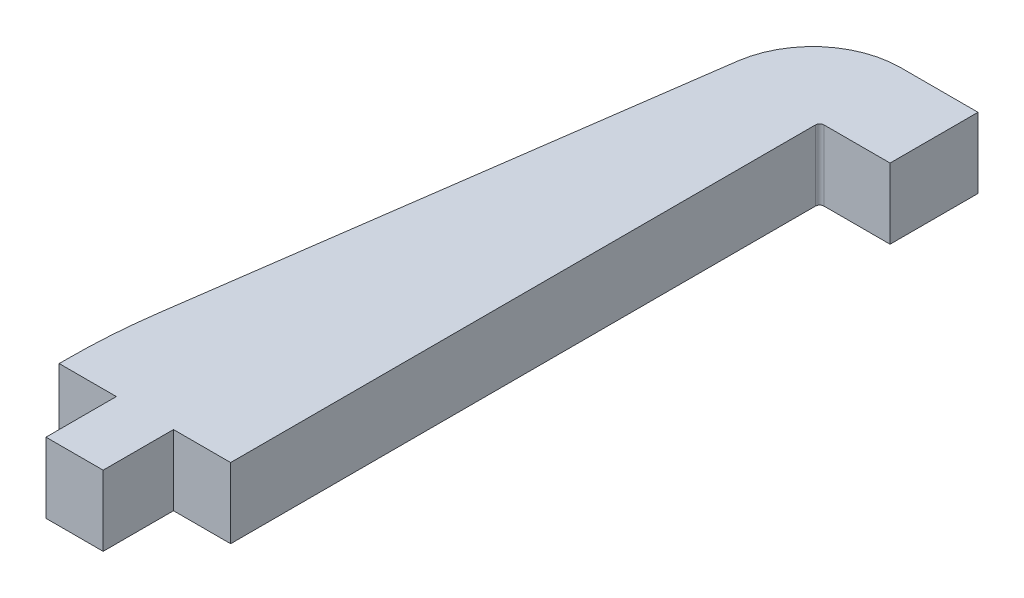
ISO-10303-21;
HEADER;
FILE_DESCRIPTION(('STEP AP214'),'2;1');
FILE_NAME('part.step','',(''),(''),'','','');
FILE_SCHEMA(('AUTOMOTIVE_DESIGN { 1 0 10303 214 1 1 1 1 }'));
ENDSEC;
DATA;
#1=APPLICATION_CONTEXT('core data for automotive mechanical design processes');
#2=APPLICATION_PROTOCOL_DEFINITION('international standard','automotive_design',2000,#1);
#3=PRODUCT_CONTEXT('',#1,'mechanical');
#4=PRODUCT('Part','Part','',(#3));
#5=PRODUCT_RELATED_PRODUCT_CATEGORY('part','',(#4));
#6=PRODUCT_DEFINITION_FORMATION('','',#4);
#7=PRODUCT_DEFINITION_CONTEXT('part definition',#1,'design');
#8=PRODUCT_DEFINITION('design','',#6,#7);
#9=PRODUCT_DEFINITION_SHAPE('','',#8);
#10=(LENGTH_UNIT() NAMED_UNIT(*) SI_UNIT(.MILLI.,.METRE.));
#11=(NAMED_UNIT(*) PLANE_ANGLE_UNIT() SI_UNIT($,.RADIAN.));
#12=(NAMED_UNIT(*) SI_UNIT($,.STERADIAN.) SOLID_ANGLE_UNIT());
#13=UNCERTAINTY_MEASURE_WITH_UNIT(LENGTH_MEASURE(1.E-05),#10,'distance_accuracy_value','');
#14=(GEOMETRIC_REPRESENTATION_CONTEXT(3) GLOBAL_UNCERTAINTY_ASSIGNED_CONTEXT((#13)) GLOBAL_UNIT_ASSIGNED_CONTEXT((#10,
#11,#12)) REPRESENTATION_CONTEXT('',''));
#15=CARTESIAN_POINT('',(0.,0.,0.));
#16=DIRECTION('',(0.,0.,1.));
#17=DIRECTION('',(1.,0.,0.));
#18=AXIS2_PLACEMENT_3D('',#15,#16,#17);
#19=CARTESIAN_POINT('',(0.,8.,-77.));
#20=DIRECTION('',(0.,0.,1.));
#21=DIRECTION('',(1.,0.,0.));
#22=AXIS2_PLACEMENT_3D('',#19,#20,#21);
#23=PLANE('',#22);
#24=DIRECTION('',(-1.,0.,0.));
#25=VECTOR('',#24,1.);
#26=CARTESIAN_POINT('',(0.,0.,-77.));
#27=LINE('',#26,#25);
#28=CARTESIAN_POINT('',(27.5,0.,-77.));
#29=VERTEX_POINT('',#28);
#30=CARTESIAN_POINT('',(18.6928673781623,0.,-77.));
#31=VERTEX_POINT('',#30);
#32=EDGE_CURVE('E203',#29,#31,#27,.T.);
#33=ORIENTED_EDGE('',*,*,#32,.T.);
#34=DIRECTION('',(0.,-1.,0.));
#35=VECTOR('',#34,1.);
#36=CARTESIAN_POINT('',(18.6928673781623,8.,-77.));
#37=LINE('',#36,#35);
#38=CARTESIAN_POINT('',(18.6928673781623,8.,-77.));
#39=VERTEX_POINT('',#38);
#40=EDGE_CURVE('E261',#31,#39,#37,.F.);
#41=ORIENTED_EDGE('',*,*,#40,.T.);
#42=DIRECTION('',(-1.,0.,0.));
#43=VECTOR('',#42,1.);
#44=CARTESIAN_POINT('',(0.,8.,-77.));
#45=LINE('',#44,#43);
#46=CARTESIAN_POINT('',(27.5,8.,-77.));
#47=VERTEX_POINT('',#46);
#48=EDGE_CURVE('E157',#47,#39,#45,.T.);
#49=ORIENTED_EDGE('',*,*,#48,.F.);
#50=DIRECTION('',(0.,-1.,0.));
#51=VECTOR('',#50,1.);
#52=CARTESIAN_POINT('',(27.5,8.,-77.));
#53=LINE('',#52,#51);
#54=EDGE_CURVE('E202',#47,#29,#53,.T.);
#55=ORIENTED_EDGE('',*,*,#54,.T.);
#56=EDGE_LOOP('',(#33,#41,#49,#55));
#57=FACE_BOUND('',#56,.T.);
#58=ADVANCED_FACE('F42',(#57),#23,.F.);
#59=CARTESIAN_POINT('',(0.,8.,0.));
#60=DIRECTION('',(1.,0.,0.));
#61=DIRECTION('',(0.,0.,-1.));
#62=AXIS2_PLACEMENT_3D('',#59,#60,#61);
#63=PLANE('',#62);
#64=DIRECTION('',(0.,0.,1.));
#65=VECTOR('',#64,1.);
#66=CARTESIAN_POINT('',(0.,8.,0.));
#67=LINE('',#66,#65);
#68=CARTESIAN_POINT('',(0.,8.,-0.951425940112669));
#69=VERTEX_POINT('',#68);
#70=CARTESIAN_POINT('',(0.,8.,0.));
#71=VERTEX_POINT('',#70);
#72=EDGE_CURVE('E143',#69,#71,#67,.T.);
#73=ORIENTED_EDGE('',*,*,#72,.F.);
#74=DIRECTION('',(0.,1.,0.));
#75=VECTOR('',#74,1.);
#76=CARTESIAN_POINT('',(0.,0.,-0.951425940112669));
#77=LINE('',#76,#75);
#78=CARTESIAN_POINT('',(0.,0.,-0.951425940112669));
#79=VERTEX_POINT('',#78);
#80=EDGE_CURVE('E275',#69,#79,#77,.F.);
#81=ORIENTED_EDGE('',*,*,#80,.T.);
#82=DIRECTION('',(0.,0.,1.));
#83=VECTOR('',#82,1.);
#84=CARTESIAN_POINT('',(0.,0.,0.));
#85=LINE('',#84,#83);
#86=CARTESIAN_POINT('',(0.,0.,0.));
#87=VERTEX_POINT('',#86);
#88=EDGE_CURVE('E163',#79,#87,#85,.T.);
#89=ORIENTED_EDGE('',*,*,#88,.T.);
#90=DIRECTION('',(0.,-1.,0.));
#91=VECTOR('',#90,1.);
#92=CARTESIAN_POINT('',(0.,8.,0.));
#93=LINE('',#92,#91);
#94=EDGE_CURVE('E160',#71,#87,#93,.T.);
#95=ORIENTED_EDGE('',*,*,#94,.F.);
#96=EDGE_LOOP('',(#73,#81,#89,#95));
#97=FACE_BOUND('',#96,.T.);
#98=ADVANCED_FACE('F161',(#97),#63,.F.);
#99=CARTESIAN_POINT('',(0.,8.,0.));
#100=DIRECTION('',(0.,0.,-1.));
#101=DIRECTION('',(-1.,0.,0.));
#102=AXIS2_PLACEMENT_3D('',#99,#100,#101);
#103=PLANE('',#102);
#104=DIRECTION('',(1.,0.,0.));
#105=VECTOR('',#104,1.);
#106=CARTESIAN_POINT('',(0.,0.,0.));
#107=LINE('',#106,#105);
#108=CARTESIAN_POINT('',(6.5,0.,0.));
#109=VERTEX_POINT('',#108);
#110=EDGE_CURVE('E209',#87,#109,#107,.T.);
#111=ORIENTED_EDGE('',*,*,#110,.T.);
#112=DIRECTION('',(0.,-1.,0.));
#113=VECTOR('',#112,1.);
#114=CARTESIAN_POINT('',(6.5,8.,0.));
#115=LINE('',#114,#113);
#116=CARTESIAN_POINT('',(6.5,8.,0.));
#117=VERTEX_POINT('',#116);
#118=EDGE_CURVE('E169',#117,#109,#115,.T.);
#119=ORIENTED_EDGE('',*,*,#118,.F.);
#120=DIRECTION('',(1.,0.,0.));
#121=VECTOR('',#120,1.);
#122=CARTESIAN_POINT('',(0.,8.,0.));
#123=LINE('',#122,#121);
#124=EDGE_CURVE('E149',#71,#117,#123,.T.);
#125=ORIENTED_EDGE('',*,*,#124,.F.);
#126=ORIENTED_EDGE('',*,*,#94,.T.);
#127=EDGE_LOOP('',(#111,#119,#125,#126));
#128=FACE_BOUND('',#127,.T.);
#129=ADVANCED_FACE('F171',(#128),#103,.F.);
#130=CARTESIAN_POINT('',(6.5,8.,0.));
#131=DIRECTION('',(-1.,0.,0.));
#132=DIRECTION('',(0.,0.,1.));
#133=AXIS2_PLACEMENT_3D('',#130,#131,#132);
#134=PLANE('',#133);
#135=DIRECTION('',(0.,0.,-1.));
#136=VECTOR('',#135,1.);
#137=CARTESIAN_POINT('',(6.5,0.,0.));
#138=LINE('',#137,#136);
#139=CARTESIAN_POINT('',(6.5,0.,8.));
#140=VERTEX_POINT('',#139);
#141=EDGE_CURVE('E212',#140,#109,#138,.T.);
#142=ORIENTED_EDGE('',*,*,#141,.F.);
#143=DIRECTION('',(0.,-1.,0.));
#144=VECTOR('',#143,1.);
#145=CARTESIAN_POINT('',(6.5,8.,8.));
#146=LINE('',#145,#144);
#147=CARTESIAN_POINT('',(6.5,8.,8.));
#148=VERTEX_POINT('',#147);
#149=EDGE_CURVE('E251',#148,#140,#146,.T.);
#150=ORIENTED_EDGE('',*,*,#149,.F.);
#151=DIRECTION('',(0.,0.,-1.));
#152=VECTOR('',#151,1.);
#153=CARTESIAN_POINT('',(6.5,8.,0.));
#154=LINE('',#153,#152);
#155=EDGE_CURVE('E174',#148,#117,#154,.T.);
#156=ORIENTED_EDGE('',*,*,#155,.T.);
#157=ORIENTED_EDGE('',*,*,#118,.T.);
#158=EDGE_LOOP('',(#142,#150,#156,#157));
#159=FACE_BOUND('',#158,.T.);
#160=ADVANCED_FACE('F361',(#159),#134,.T.);
#161=CARTESIAN_POINT('',(0.,8.,8.));
#162=DIRECTION('',(0.,0.,-1.));
#163=DIRECTION('',(-1.,0.,0.));
#164=AXIS2_PLACEMENT_3D('',#161,#162,#163);
#165=PLANE('',#164);
#166=DIRECTION('',(1.,0.,0.));
#167=VECTOR('',#166,1.);
#168=CARTESIAN_POINT('',(0.,0.,8.));
#169=LINE('',#168,#167);
#170=CARTESIAN_POINT('',(13.,0.,8.));
#171=VERTEX_POINT('',#170);
#172=EDGE_CURVE('E217',#140,#171,#169,.T.);
#173=ORIENTED_EDGE('',*,*,#172,.T.);
#174=DIRECTION('',(0.,-1.,0.));
#175=VECTOR('',#174,1.);
#176=CARTESIAN_POINT('',(13.,8.,8.));
#177=LINE('',#176,#175);
#178=CARTESIAN_POINT('',(13.,8.,8.));
#179=VERTEX_POINT('',#178);
#180=EDGE_CURVE('E248',#179,#171,#177,.T.);
#181=ORIENTED_EDGE('',*,*,#180,.F.);
#182=DIRECTION('',(1.,0.,0.));
#183=VECTOR('',#182,1.);
#184=CARTESIAN_POINT('',(0.,8.,8.));
#185=LINE('',#184,#183);
#186=EDGE_CURVE('E178',#148,#179,#185,.T.);
#187=ORIENTED_EDGE('',*,*,#186,.F.);
#188=ORIENTED_EDGE('',*,*,#149,.T.);
#189=EDGE_LOOP('',(#173,#181,#187,#188));
#190=FACE_BOUND('',#189,.T.);
#191=ADVANCED_FACE('F359',(#190),#165,.F.);
#192=CARTESIAN_POINT('',(13.,8.,0.));
#193=DIRECTION('',(1.,0.,0.));
#194=DIRECTION('',(0.,0.,-1.));
#195=AXIS2_PLACEMENT_3D('',#192,#193,#194);
#196=PLANE('',#195);
#197=DIRECTION('',(0.,0.,1.));
#198=VECTOR('',#197,1.);
#199=CARTESIAN_POINT('',(13.,0.,0.));
#200=LINE('',#199,#198);
#201=CARTESIAN_POINT('',(13.,0.,0.));
#202=VERTEX_POINT('',#201);
#203=EDGE_CURVE('E221',#202,#171,#200,.T.);
#204=ORIENTED_EDGE('',*,*,#203,.F.);
#205=DIRECTION('',(0.,-1.,0.));
#206=VECTOR('',#205,1.);
#207=CARTESIAN_POINT('',(13.,8.,0.));
#208=LINE('',#207,#206);
#209=CARTESIAN_POINT('',(13.,8.,0.));
#210=VERTEX_POINT('',#209);
#211=EDGE_CURVE('E245',#210,#202,#208,.T.);
#212=ORIENTED_EDGE('',*,*,#211,.F.);
#213=DIRECTION('',(0.,0.,1.));
#214=VECTOR('',#213,1.);
#215=CARTESIAN_POINT('',(13.,8.,0.));
#216=LINE('',#215,#214);
#217=EDGE_CURVE('E182',#210,#179,#216,.T.);
#218=ORIENTED_EDGE('',*,*,#217,.T.);
#219=ORIENTED_EDGE('',*,*,#180,.T.);
#220=EDGE_LOOP('',(#204,#212,#218,#219));
#221=FACE_BOUND('',#220,.T.);
#222=ADVANCED_FACE('F353',(#221),#196,.T.);
#223=CARTESIAN_POINT('',(19.5,0.,0.));
#224=VERTEX_POINT('',#223);
#225=EDGE_CURVE('E213',#202,#224,#107,.T.);
#226=ORIENTED_EDGE('',*,*,#225,.T.);
#227=DIRECTION('',(0.,-1.,0.));
#228=VECTOR('',#227,1.);
#229=CARTESIAN_POINT('',(19.5,8.,0.));
#230=LINE('',#229,#228);
#231=CARTESIAN_POINT('',(19.5,8.,0.));
#232=VERTEX_POINT('',#231);
#233=EDGE_CURVE('E241',#232,#224,#230,.T.);
#234=ORIENTED_EDGE('',*,*,#233,.F.);
#235=EDGE_CURVE('E176',#210,#232,#123,.T.);
#236=ORIENTED_EDGE('',*,*,#235,.F.);
#237=ORIENTED_EDGE('',*,*,#211,.T.);
#238=EDGE_LOOP('',(#226,#234,#236,#237));
#239=FACE_BOUND('',#238,.T.);
#240=ADVANCED_FACE('F343',(#239),#103,.F.);
#241=CARTESIAN_POINT('',(19.5,8.,0.));
#242=DIRECTION('',(-1.,0.,0.));
#243=DIRECTION('',(0.,0.,1.));
#244=AXIS2_PLACEMENT_3D('',#241,#242,#243);
#245=PLANE('',#244);
#246=DIRECTION('',(0.,0.,-1.));
#247=VECTOR('',#246,1.);
#248=CARTESIAN_POINT('',(19.5,0.,0.));
#249=LINE('',#248,#247);
#250=CARTESIAN_POINT('',(19.5,0.,-66.5));
#251=VERTEX_POINT('',#250);
#252=EDGE_CURVE('E225',#224,#251,#249,.T.);
#253=ORIENTED_EDGE('',*,*,#252,.T.);
#254=DIRECTION('',(0.,-1.,0.));
#255=VECTOR('',#254,1.);
#256=CARTESIAN_POINT('',(19.5,8.,-66.5));
#257=LINE('',#256,#255);
#258=CARTESIAN_POINT('',(19.5,8.,-66.5));
#259=VERTEX_POINT('',#258);
#260=EDGE_CURVE('E58',#251,#259,#257,.F.);
#261=ORIENTED_EDGE('',*,*,#260,.T.);
#262=DIRECTION('',(0.,0.,-1.));
#263=VECTOR('',#262,1.);
#264=CARTESIAN_POINT('',(19.5,8.,0.));
#265=LINE('',#264,#263);
#266=EDGE_CURVE('E181',#232,#259,#265,.T.);
#267=ORIENTED_EDGE('',*,*,#266,.F.);
#268=ORIENTED_EDGE('',*,*,#233,.T.);
#269=EDGE_LOOP('',(#253,#261,#267,#268));
#270=FACE_BOUND('',#269,.T.);
#271=ADVANCED_FACE('F345',(#270),#245,.F.);
#272=CARTESIAN_POINT('',(0.,8.,-67.));
#273=DIRECTION('',(0.,0.,-1.));
#274=DIRECTION('',(-1.,0.,0.));
#275=AXIS2_PLACEMENT_3D('',#272,#273,#274);
#276=PLANE('',#275);
#277=DIRECTION('',(1.,0.,0.));
#278=VECTOR('',#277,1.);
#279=CARTESIAN_POINT('',(0.,8.,-67.));
#280=LINE('',#279,#278);
#281=CARTESIAN_POINT('',(20.,8.,-67.));
#282=VERTEX_POINT('',#281);
#283=CARTESIAN_POINT('',(27.5,8.,-67.));
#284=VERTEX_POINT('',#283);
#285=EDGE_CURVE('E188',#282,#284,#280,.T.);
#286=ORIENTED_EDGE('',*,*,#285,.F.);
#287=DIRECTION('',(0.,-1.,0.));
#288=VECTOR('',#287,1.);
#289=CARTESIAN_POINT('',(20.,0.,-67.));
#290=LINE('',#289,#288);
#291=CARTESIAN_POINT('',(20.,0.,-67.));
#292=VERTEX_POINT('',#291);
#293=EDGE_CURVE('E286',#282,#292,#290,.T.);
#294=ORIENTED_EDGE('',*,*,#293,.T.);
#295=DIRECTION('',(1.,0.,0.));
#296=VECTOR('',#295,1.);
#297=CARTESIAN_POINT('',(0.,0.,-67.));
#298=LINE('',#297,#296);
#299=CARTESIAN_POINT('',(27.5,0.,-67.));
#300=VERTEX_POINT('',#299);
#301=EDGE_CURVE('E228',#292,#300,#298,.T.);
#302=ORIENTED_EDGE('',*,*,#301,.T.);
#303=DIRECTION('',(0.,-1.,0.));
#304=VECTOR('',#303,1.);
#305=CARTESIAN_POINT('',(27.5,8.,-67.));
#306=LINE('',#305,#304);
#307=EDGE_CURVE('E237',#284,#300,#306,.T.);
#308=ORIENTED_EDGE('',*,*,#307,.F.);
#309=EDGE_LOOP('',(#286,#294,#302,#308));
#310=FACE_BOUND('',#309,.T.);
#311=ADVANCED_FACE('F295',(#310),#276,.F.);
#312=CARTESIAN_POINT('',(27.5,8.,0.));
#313=DIRECTION('',(1.,0.,0.));
#314=DIRECTION('',(0.,0.,-1.));
#315=AXIS2_PLACEMENT_3D('',#312,#313,#314);
#316=PLANE('',#315);
#317=DIRECTION('',(0.,0.,1.));
#318=VECTOR('',#317,1.);
#319=CARTESIAN_POINT('',(27.5,0.,0.));
#320=LINE('',#319,#318);
#321=EDGE_CURVE('E231',#29,#300,#320,.T.);
#322=ORIENTED_EDGE('',*,*,#321,.F.);
#323=ORIENTED_EDGE('',*,*,#54,.F.);
#324=DIRECTION('',(0.,0.,1.));
#325=VECTOR('',#324,1.);
#326=CARTESIAN_POINT('',(27.5,8.,0.));
#327=LINE('',#326,#325);
#328=EDGE_CURVE('E198',#47,#284,#327,.T.);
#329=ORIENTED_EDGE('',*,*,#328,.T.);
#330=ORIENTED_EDGE('',*,*,#307,.T.);
#331=EDGE_LOOP('',(#322,#323,#329,#330));
#332=FACE_BOUND('',#331,.T.);
#333=ADVANCED_FACE('F303',(#332),#316,.T.);
#334=CARTESIAN_POINT('',(0.,8.,0.));
#335=DIRECTION('',(0.,1.,0.));
#336=DIRECTION('',(0.,0.,1.));
#337=AXIS2_PLACEMENT_3D('',#334,#335,#336);
#338=PLANE('',#337);
#339=DIRECTION('',(0.139173100960066,0.,-0.99026806874157));
#340=VECTOR('',#339,1.);
#341=CARTESIAN_POINT('',(-0.805729719262953,8.,-0.11323792728974));
#342=LINE('',#341,#340);
#343=CARTESIAN_POINT('',(8.79018669074656,8.,-68.3917310096007));
#344=VERTEX_POINT('',#343);
#345=CARTESIAN_POINT('',(0.681235188090087,8.,-10.6935430073173));
#346=VERTEX_POINT('',#345);
#347=EDGE_CURVE('E258',#344,#346,#342,.F.);
#348=ORIENTED_EDGE('',*,*,#347,.T.);
#349=CARTESIAN_POINT('',(70.,8.,-0.951425940112669));
#350=DIRECTION('',(0.,1.,0.));
#351=DIRECTION('',(0.,0.,1.));
#352=AXIS2_PLACEMENT_3D('',#349,#350,#351);
#353=CIRCLE('',#352,70.);
#354=EDGE_CURVE('E152',#346,#69,#353,.T.);
#355=ORIENTED_EDGE('',*,*,#354,.T.);
#356=ORIENTED_EDGE('',*,*,#72,.T.);
#357=ORIENTED_EDGE('',*,*,#124,.T.);
#358=ORIENTED_EDGE('',*,*,#155,.F.);
#359=ORIENTED_EDGE('',*,*,#186,.T.);
#360=ORIENTED_EDGE('',*,*,#217,.F.);
#361=ORIENTED_EDGE('',*,*,#235,.T.);
#362=ORIENTED_EDGE('',*,*,#266,.T.);
#363=CARTESIAN_POINT('',(20.,8.,-66.5));
#364=DIRECTION('',(0.,1.,0.));
#365=DIRECTION('',(0.,0.,1.));
#366=AXIS2_PLACEMENT_3D('',#363,#364,#365);
#367=CIRCLE('',#366,0.5);
#368=EDGE_CURVE('E11',#259,#282,#367,.F.);
#369=ORIENTED_EDGE('',*,*,#368,.T.);
#370=ORIENTED_EDGE('',*,*,#285,.T.);
#371=ORIENTED_EDGE('',*,*,#328,.F.);
#372=ORIENTED_EDGE('',*,*,#48,.T.);
#373=CARTESIAN_POINT('',(18.6928673781623,8.,-67.));
#374=DIRECTION('',(0.,1.,0.));
#375=DIRECTION('',(0.,0.,1.));
#376=AXIS2_PLACEMENT_3D('',#373,#374,#375);
#377=CIRCLE('',#376,10.);
#378=EDGE_CURVE('E265',#39,#344,#377,.T.);
#379=ORIENTED_EDGE('',*,*,#378,.T.);
#380=EDGE_LOOP('',(#348,#355,#356,#357,#358,#359,#360,#361,#362,#369,#370,#371,#372,#379));
#381=FACE_BOUND('',#380,.T.);
#382=ADVANCED_FACE('F146',(#381),#338,.T.);
#383=CARTESIAN_POINT('',(0.,0.,0.));
#384=DIRECTION('',(0.,1.,0.));
#385=DIRECTION('',(0.,0.,1.));
#386=AXIS2_PLACEMENT_3D('',#383,#384,#385);
#387=PLANE('',#386);
#388=ORIENTED_EDGE('',*,*,#88,.F.);
#389=CARTESIAN_POINT('',(70.,0.,-0.951425940112669));
#390=DIRECTION('',(0.,1.,0.));
#391=DIRECTION('',(0.,0.,1.));
#392=AXIS2_PLACEMENT_3D('',#389,#390,#391);
#393=CIRCLE('',#392,70.);
#394=CARTESIAN_POINT('',(0.681235188090088,0.,-10.6935430073173));
#395=VERTEX_POINT('',#394);
#396=EDGE_CURVE('E278',#79,#395,#393,.F.);
#397=ORIENTED_EDGE('',*,*,#396,.T.);
#398=DIRECTION('',(-0.139173100960066,0.,0.99026806874157));
#399=VECTOR('',#398,1.);
#400=CARTESIAN_POINT('',(0.,0.,-5.84630277615844));
#401=LINE('',#400,#399);
#402=CARTESIAN_POINT('',(8.79018669074656,0.,-68.3917310096006));
#403=VERTEX_POINT('',#402);
#404=EDGE_CURVE('E168',#395,#403,#401,.F.);
#405=ORIENTED_EDGE('',*,*,#404,.T.);
#406=CARTESIAN_POINT('',(18.6928673781623,0.,-67.));
#407=DIRECTION('',(0.,1.,0.));
#408=DIRECTION('',(0.,0.,1.));
#409=AXIS2_PLACEMENT_3D('',#406,#407,#408);
#410=CIRCLE('',#409,10.);
#411=EDGE_CURVE('E272',#403,#31,#410,.F.);
#412=ORIENTED_EDGE('',*,*,#411,.T.);
#413=ORIENTED_EDGE('',*,*,#32,.F.);
#414=ORIENTED_EDGE('',*,*,#321,.T.);
#415=ORIENTED_EDGE('',*,*,#301,.F.);
#416=CARTESIAN_POINT('',(20.,0.,-66.5));
#417=DIRECTION('',(0.,1.,0.));
#418=DIRECTION('',(0.,0.,1.));
#419=AXIS2_PLACEMENT_3D('',#416,#417,#418);
#420=CIRCLE('',#419,0.5);
#421=EDGE_CURVE('E51',#292,#251,#420,.T.);
#422=ORIENTED_EDGE('',*,*,#421,.T.);
#423=ORIENTED_EDGE('',*,*,#252,.F.);
#424=ORIENTED_EDGE('',*,*,#225,.F.);
#425=ORIENTED_EDGE('',*,*,#203,.T.);
#426=ORIENTED_EDGE('',*,*,#172,.F.);
#427=ORIENTED_EDGE('',*,*,#141,.T.);
#428=ORIENTED_EDGE('',*,*,#110,.F.);
#429=EDGE_LOOP('',(#388,#397,#405,#412,#413,#414,#415,#422,#423,#424,#425,#426,#427,#428));
#430=FACE_BOUND('',#429,.T.);
#431=ADVANCED_FACE('F299',(#430),#387,.F.);
#432=CARTESIAN_POINT('',(0.,8.,-5.84630277615844));
#433=DIRECTION('',(0.99026806874157,0.,0.139173100960066));
#434=DIRECTION('',(0.,-1.,0.));
#435=AXIS2_PLACEMENT_3D('',#432,#433,#434);
#436=PLANE('',#435);
#437=ORIENTED_EDGE('',*,*,#404,.F.);
#438=DIRECTION('',(0.,-1.,0.));
#439=VECTOR('',#438,1.);
#440=CARTESIAN_POINT('',(0.681235188090087,8.,-10.6935430073173));
#441=LINE('',#440,#439);
#442=EDGE_CURVE('E281',#395,#346,#441,.F.);
#443=ORIENTED_EDGE('',*,*,#442,.T.);
#444=ORIENTED_EDGE('',*,*,#347,.F.);
#445=DIRECTION('',(0.,1.,0.));
#446=VECTOR('',#445,1.);
#447=CARTESIAN_POINT('',(8.79018669074656,0.,-68.3917310096007));
#448=LINE('',#447,#446);
#449=EDGE_CURVE('E268',#344,#403,#448,.F.);
#450=ORIENTED_EDGE('',*,*,#449,.T.);
#451=EDGE_LOOP('',(#437,#443,#444,#450));
#452=FACE_BOUND('',#451,.T.);
#453=ADVANCED_FACE('F324',(#452),#436,.F.);
#454=CARTESIAN_POINT('',(18.6928673781623,8.,-67.));
#455=DIRECTION('',(0.,1.,0.));
#456=DIRECTION('',(0.,0.,1.));
#457=AXIS2_PLACEMENT_3D('',#454,#455,#456);
#458=CYLINDRICAL_SURFACE('',#457,10.);
#459=ORIENTED_EDGE('',*,*,#411,.F.);
#460=ORIENTED_EDGE('',*,*,#449,.F.);
#461=ORIENTED_EDGE('',*,*,#378,.F.);
#462=ORIENTED_EDGE('',*,*,#40,.F.);
#463=EDGE_LOOP('',(#459,#460,#461,#462));
#464=FACE_BOUND('',#463,.T.);
#465=ADVANCED_FACE('F312',(#464),#458,.T.);
#466=CARTESIAN_POINT('',(70.,8.,-0.951425940112669));
#467=DIRECTION('',(0.,-1.,0.));
#468=DIRECTION('',(0.,0.,-1.));
#469=AXIS2_PLACEMENT_3D('',#466,#467,#468);
#470=CYLINDRICAL_SURFACE('',#469,70.);
#471=ORIENTED_EDGE('',*,*,#354,.F.);
#472=ORIENTED_EDGE('',*,*,#442,.F.);
#473=ORIENTED_EDGE('',*,*,#396,.F.);
#474=ORIENTED_EDGE('',*,*,#80,.F.);
#475=EDGE_LOOP('',(#471,#472,#473,#474));
#476=FACE_BOUND('',#475,.T.);
#477=ADVANCED_FACE('F308',(#476),#470,.T.);
#478=CARTESIAN_POINT('',(20.,8.,-66.5));
#479=DIRECTION('',(0.,1.,0.));
#480=DIRECTION('',(0.,0.,1.));
#481=AXIS2_PLACEMENT_3D('',#478,#479,#480);
#482=CYLINDRICAL_SURFACE('',#481,0.5);
#483=ORIENTED_EDGE('',*,*,#368,.F.);
#484=ORIENTED_EDGE('',*,*,#260,.F.);
#485=ORIENTED_EDGE('',*,*,#421,.F.);
#486=ORIENTED_EDGE('',*,*,#293,.F.);
#487=EDGE_LOOP('',(#483,#484,#485,#486));
#488=FACE_BOUND('',#487,.T.);
#489=ADVANCED_FACE('F44',(#488),#482,.F.);
#490=CLOSED_SHELL('',(#58,#98,#129,#160,#191,#222,#240,#271,#311,#333,#382,#431,#453,#465,#477,#489));
#491=MANIFOLD_SOLID_BREP('B2',#490);
#492=ADVANCED_BREP_SHAPE_REPRESENTATION('',(#18,#491),#14);
#493=SHAPE_DEFINITION_REPRESENTATION(#9,#492);
ENDSEC;
END-ISO-10303-21;
